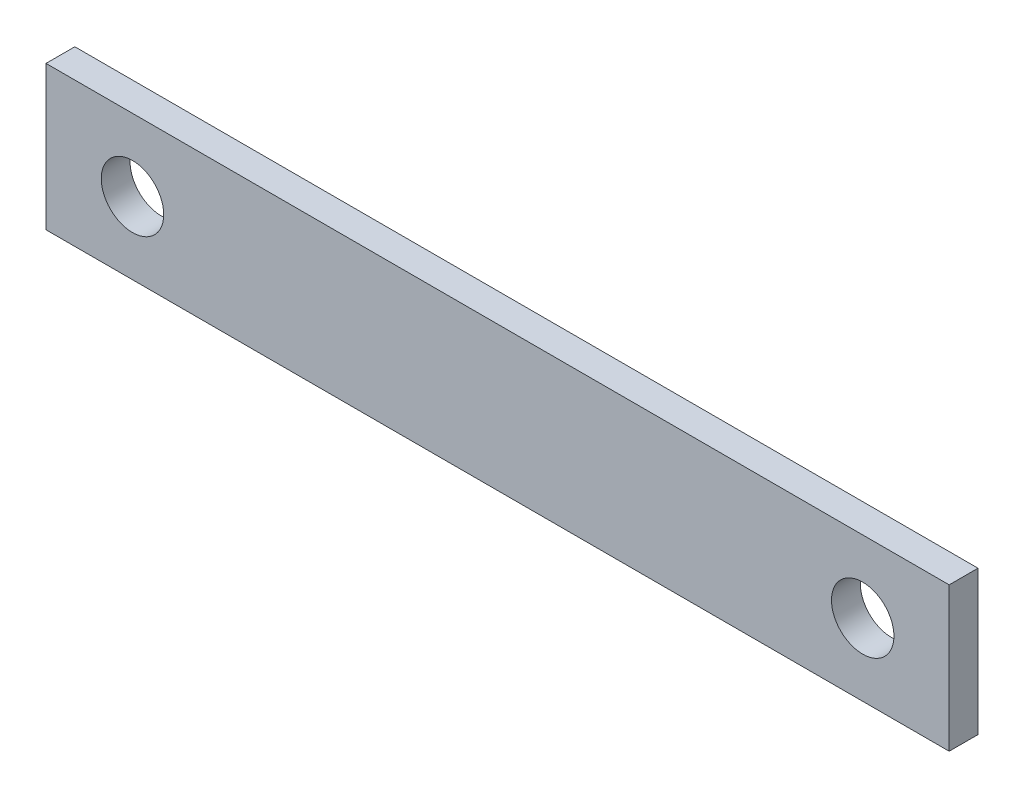
ISO-10303-21;
HEADER;
FILE_DESCRIPTION(('STEP AP214'),'2;1');
FILE_NAME('part.step','',(''),(''),'','','');
FILE_SCHEMA(('AUTOMOTIVE_DESIGN { 1 0 10303 214 1 1 1 1 }'));
ENDSEC;
DATA;
#1=APPLICATION_CONTEXT('core data for automotive mechanical design processes');
#2=APPLICATION_PROTOCOL_DEFINITION('international standard','automotive_design',2000,#1);
#3=PRODUCT_CONTEXT('',#1,'mechanical');
#4=PRODUCT('Part','Part','',(#3));
#5=PRODUCT_RELATED_PRODUCT_CATEGORY('part','',(#4));
#6=PRODUCT_DEFINITION_FORMATION('','',#4);
#7=PRODUCT_DEFINITION_CONTEXT('part definition',#1,'design');
#8=PRODUCT_DEFINITION('design','',#6,#7);
#9=PRODUCT_DEFINITION_SHAPE('','',#8);
#10=(LENGTH_UNIT() NAMED_UNIT(*) SI_UNIT(.MILLI.,.METRE.));
#11=(NAMED_UNIT(*) PLANE_ANGLE_UNIT() SI_UNIT($,.RADIAN.));
#12=(NAMED_UNIT(*) SI_UNIT($,.STERADIAN.) SOLID_ANGLE_UNIT());
#13=UNCERTAINTY_MEASURE_WITH_UNIT(LENGTH_MEASURE(1.E-05),#10,'distance_accuracy_value','');
#14=(GEOMETRIC_REPRESENTATION_CONTEXT(3) GLOBAL_UNCERTAINTY_ASSIGNED_CONTEXT((#13)) GLOBAL_UNIT_ASSIGNED_CONTEXT((#10,
#11,#12)) REPRESENTATION_CONTEXT('',''));
#15=CARTESIAN_POINT('',(0.,0.,0.));
#16=DIRECTION('',(0.,0.,1.));
#17=DIRECTION('',(1.,0.,0.));
#18=AXIS2_PLACEMENT_3D('',#15,#16,#17);
#19=CARTESIAN_POINT('',(-47.,7.49999999999999,3.));
#20=DIRECTION('',(1.,0.,0.));
#21=DIRECTION('',(0.,0.,-1.));
#22=AXIS2_PLACEMENT_3D('',#19,#20,#21);
#23=PLANE('',#22);
#24=DIRECTION('',(0.,-1.,0.));
#25=VECTOR('',#24,1.);
#26=CARTESIAN_POINT('',(-47.,7.49999999999999,0.));
#27=LINE('',#26,#25);
#28=CARTESIAN_POINT('',(-47.,7.49999999999999,0.));
#29=VERTEX_POINT('',#28);
#30=CARTESIAN_POINT('',(-47.,-7.50000000000001,0.));
#31=VERTEX_POINT('',#30);
#32=EDGE_CURVE('E96',#29,#31,#27,.T.);
#33=ORIENTED_EDGE('',*,*,#32,.T.);
#34=DIRECTION('',(0.,0.,-1.));
#35=VECTOR('',#34,1.);
#36=CARTESIAN_POINT('',(-47.,-7.50000000000001,3.));
#37=LINE('',#36,#35);
#38=CARTESIAN_POINT('',(-47.,-7.50000000000001,3.));
#39=VERTEX_POINT('',#38);
#40=EDGE_CURVE('E11',#39,#31,#37,.T.);
#41=ORIENTED_EDGE('',*,*,#40,.F.);
#42=DIRECTION('',(0.,-1.,0.));
#43=VECTOR('',#42,1.);
#44=CARTESIAN_POINT('',(-47.,7.49999999999999,3.));
#45=LINE('',#44,#43);
#46=CARTESIAN_POINT('',(-47.,7.49999999999999,3.));
#47=VERTEX_POINT('',#46);
#48=EDGE_CURVE('E84',#47,#39,#45,.T.);
#49=ORIENTED_EDGE('',*,*,#48,.F.);
#50=DIRECTION('',(0.,0.,-1.));
#51=VECTOR('',#50,1.);
#52=CARTESIAN_POINT('',(-47.,7.49999999999999,3.));
#53=LINE('',#52,#51);
#54=EDGE_CURVE('E92',#47,#29,#53,.T.);
#55=ORIENTED_EDGE('',*,*,#54,.T.);
#56=EDGE_LOOP('',(#33,#41,#49,#55));
#57=FACE_BOUND('',#56,.T.);
#58=ADVANCED_FACE('F33',(#57),#23,.F.);
#59=CARTESIAN_POINT('',(47.,-7.5,3.));
#60=DIRECTION('',(0.,1.,0.));
#61=DIRECTION('',(-1.,0.,0.));
#62=AXIS2_PLACEMENT_3D('',#59,#60,#61);
#63=PLANE('',#62);
#64=DIRECTION('',(1.,0.,0.));
#65=VECTOR('',#64,1.);
#66=CARTESIAN_POINT('',(47.,-7.5,0.));
#67=LINE('',#66,#65);
#68=CARTESIAN_POINT('',(47.,-7.5,0.));
#69=VERTEX_POINT('',#68);
#70=EDGE_CURVE('E88',#31,#69,#67,.T.);
#71=ORIENTED_EDGE('',*,*,#70,.T.);
#72=DIRECTION('',(0.,0.,-1.));
#73=VECTOR('',#72,1.);
#74=CARTESIAN_POINT('',(47.,-7.5,3.));
#75=LINE('',#74,#73);
#76=CARTESIAN_POINT('',(47.,-7.5,3.));
#77=VERTEX_POINT('',#76);
#78=EDGE_CURVE('E41',#77,#69,#75,.T.);
#79=ORIENTED_EDGE('',*,*,#78,.F.);
#80=DIRECTION('',(1.,0.,0.));
#81=VECTOR('',#80,1.);
#82=CARTESIAN_POINT('',(47.,-7.5,3.));
#83=LINE('',#82,#81);
#84=EDGE_CURVE('E79',#39,#77,#83,.T.);
#85=ORIENTED_EDGE('',*,*,#84,.F.);
#86=ORIENTED_EDGE('',*,*,#40,.T.);
#87=EDGE_LOOP('',(#71,#79,#85,#86));
#88=FACE_BOUND('',#87,.T.);
#89=ADVANCED_FACE('F87',(#88),#63,.F.);
#90=CARTESIAN_POINT('',(47.,7.50000000000001,3.));
#91=DIRECTION('',(-1.,0.,0.));
#92=DIRECTION('',(0.,0.,1.));
#93=AXIS2_PLACEMENT_3D('',#90,#91,#92);
#94=PLANE('',#93);
#95=DIRECTION('',(0.,1.,0.));
#96=VECTOR('',#95,1.);
#97=CARTESIAN_POINT('',(47.,7.50000000000001,0.));
#98=LINE('',#97,#96);
#99=CARTESIAN_POINT('',(47.,7.50000000000001,0.));
#100=VERTEX_POINT('',#99);
#101=EDGE_CURVE('E66',#69,#100,#98,.T.);
#102=ORIENTED_EDGE('',*,*,#101,.T.);
#103=DIRECTION('',(0.,0.,-1.));
#104=VECTOR('',#103,1.);
#105=CARTESIAN_POINT('',(47.,7.50000000000001,3.));
#106=LINE('',#105,#104);
#107=CARTESIAN_POINT('',(47.,7.50000000000001,3.));
#108=VERTEX_POINT('',#107);
#109=EDGE_CURVE('E89',#108,#100,#106,.T.);
#110=ORIENTED_EDGE('',*,*,#109,.F.);
#111=DIRECTION('',(0.,1.,0.));
#112=VECTOR('',#111,1.);
#113=CARTESIAN_POINT('',(47.,7.50000000000001,3.));
#114=LINE('',#113,#112);
#115=EDGE_CURVE('E82',#77,#108,#114,.T.);
#116=ORIENTED_EDGE('',*,*,#115,.F.);
#117=ORIENTED_EDGE('',*,*,#78,.T.);
#118=EDGE_LOOP('',(#102,#110,#116,#117));
#119=FACE_BOUND('',#118,.T.);
#120=ADVANCED_FACE('F90',(#119),#94,.F.);
#121=CARTESIAN_POINT('',(47.,7.50000000000001,3.));
#122=DIRECTION('',(0.,-1.,0.));
#123=DIRECTION('',(1.,0.,0.));
#124=AXIS2_PLACEMENT_3D('',#121,#122,#123);
#125=PLANE('',#124);
#126=DIRECTION('',(-1.,0.,0.));
#127=VECTOR('',#126,1.);
#128=CARTESIAN_POINT('',(47.,7.50000000000001,0.));
#129=LINE('',#128,#127);
#130=EDGE_CURVE('E72',#100,#29,#129,.T.);
#131=ORIENTED_EDGE('',*,*,#130,.T.);
#132=ORIENTED_EDGE('',*,*,#54,.F.);
#133=DIRECTION('',(-1.,0.,0.));
#134=VECTOR('',#133,1.);
#135=CARTESIAN_POINT('',(47.,7.50000000000001,3.));
#136=LINE('',#135,#134);
#137=EDGE_CURVE('E49',#108,#47,#136,.T.);
#138=ORIENTED_EDGE('',*,*,#137,.F.);
#139=ORIENTED_EDGE('',*,*,#109,.T.);
#140=EDGE_LOOP('',(#131,#132,#138,#139));
#141=FACE_BOUND('',#140,.T.);
#142=ADVANCED_FACE('F104',(#141),#125,.F.);
#143=CARTESIAN_POINT('',(0.,0.,3.));
#144=DIRECTION('',(0.,0.,-1.));
#145=DIRECTION('',(-1.,0.,0.));
#146=AXIS2_PLACEMENT_3D('',#143,#144,#145);
#147=PLANE('',#146);
#148=CARTESIAN_POINT('',(38.,0.,3.));
#149=DIRECTION('',(0.,0.,1.));
#150=DIRECTION('',(1.,0.,0.));
#151=AXIS2_PLACEMENT_3D('',#148,#149,#150);
#152=CIRCLE('',#151,3.25);
#153=CARTESIAN_POINT('',(41.25,0.,3.));
#154=VERTEX_POINT('',#153);
#155=EDGE_CURVE('E113',#154,#154,#152,.T.);
#156=ORIENTED_EDGE('',*,*,#155,.F.);
#157=EDGE_LOOP('',(#156));
#158=FACE_BOUND('',#157,.T.);
#159=CARTESIAN_POINT('',(-38.,0.,3.));
#160=DIRECTION('',(0.,0.,1.));
#161=DIRECTION('',(1.,0.,0.));
#162=AXIS2_PLACEMENT_3D('',#159,#160,#161);
#163=CIRCLE('',#162,3.25);
#164=CARTESIAN_POINT('',(-34.75,0.,3.));
#165=VERTEX_POINT('',#164);
#166=EDGE_CURVE('E99',#165,#165,#163,.T.);
#167=ORIENTED_EDGE('',*,*,#166,.F.);
#168=EDGE_LOOP('',(#167));
#169=FACE_BOUND('',#168,.T.);
#170=ORIENTED_EDGE('',*,*,#48,.T.);
#171=ORIENTED_EDGE('',*,*,#84,.T.);
#172=ORIENTED_EDGE('',*,*,#115,.T.);
#173=ORIENTED_EDGE('',*,*,#137,.T.);
#174=EDGE_LOOP('',(#170,#171,#172,#173));
#175=FACE_BOUND('',#174,.T.);
#176=ADVANCED_FACE('F80',(#158,#169,#175),#147,.F.);
#177=CARTESIAN_POINT('',(0.,0.,0.));
#178=DIRECTION('',(0.,0.,-1.));
#179=DIRECTION('',(-1.,0.,0.));
#180=AXIS2_PLACEMENT_3D('',#177,#178,#179);
#181=PLANE('',#180);
#182=CARTESIAN_POINT('',(38.,0.,0.));
#183=DIRECTION('',(0.,0.,-1.));
#184=DIRECTION('',(-1.,0.,0.));
#185=AXIS2_PLACEMENT_3D('',#182,#183,#184);
#186=CIRCLE('',#185,3.25);
#187=CARTESIAN_POINT('',(41.25,0.,0.));
#188=VERTEX_POINT('',#187);
#189=EDGE_CURVE('E116',#188,#188,#186,.F.);
#190=ORIENTED_EDGE('',*,*,#189,.T.);
#191=EDGE_LOOP('',(#190));
#192=FACE_BOUND('',#191,.T.);
#193=CARTESIAN_POINT('',(-38.,0.,0.));
#194=DIRECTION('',(0.,0.,-1.));
#195=DIRECTION('',(-1.,0.,0.));
#196=AXIS2_PLACEMENT_3D('',#193,#194,#195);
#197=CIRCLE('',#196,3.25);
#198=CARTESIAN_POINT('',(-34.75,0.,0.));
#199=VERTEX_POINT('',#198);
#200=EDGE_CURVE('E110',#199,#199,#197,.F.);
#201=ORIENTED_EDGE('',*,*,#200,.T.);
#202=EDGE_LOOP('',(#201));
#203=FACE_BOUND('',#202,.T.);
#204=ORIENTED_EDGE('',*,*,#32,.F.);
#205=ORIENTED_EDGE('',*,*,#130,.F.);
#206=ORIENTED_EDGE('',*,*,#101,.F.);
#207=ORIENTED_EDGE('',*,*,#70,.F.);
#208=EDGE_LOOP('',(#204,#205,#206,#207));
#209=FACE_BOUND('',#208,.T.);
#210=ADVANCED_FACE('F107',(#192,#203,#209),#181,.T.);
#211=CARTESIAN_POINT('',(-38.,0.,-0.00100000000000013));
#212=DIRECTION('',(0.,0.,1.));
#213=DIRECTION('',(1.,0.,0.));
#214=AXIS2_PLACEMENT_3D('',#211,#212,#213);
#215=CYLINDRICAL_SURFACE('',#214,3.25);
#216=CARTESIAN_POINT('',(-34.75,0.,0.));
#217=CARTESIAN_POINT('',(-34.75,0.,0.03125));
#218=CARTESIAN_POINT('',(-34.75,0.,0.0625));
#219=CARTESIAN_POINT('',(-34.75,0.,0.125));
#220=CARTESIAN_POINT('',(-34.75,0.,0.15625));
#221=CARTESIAN_POINT('',(-34.75,0.,0.21875));
#222=CARTESIAN_POINT('',(-34.75,0.,0.25));
#223=CARTESIAN_POINT('',(-34.75,0.,0.3125));
#224=CARTESIAN_POINT('',(-34.75,0.,0.34375));
#225=CARTESIAN_POINT('',(-34.75,0.,0.40625));
#226=CARTESIAN_POINT('',(-34.75,0.,0.4375));
#227=CARTESIAN_POINT('',(-34.75,0.,0.5));
#228=CARTESIAN_POINT('',(-34.75,0.,0.53125));
#229=CARTESIAN_POINT('',(-34.75,0.,0.59375));
#230=CARTESIAN_POINT('',(-34.75,0.,0.625));
#231=CARTESIAN_POINT('',(-34.75,0.,0.6875));
#232=CARTESIAN_POINT('',(-34.75,0.,0.71875));
#233=CARTESIAN_POINT('',(-34.75,0.,0.78125));
#234=CARTESIAN_POINT('',(-34.75,0.,0.8125));
#235=CARTESIAN_POINT('',(-34.75,0.,0.875));
#236=CARTESIAN_POINT('',(-34.75,0.,0.90625));
#237=CARTESIAN_POINT('',(-34.75,0.,0.96875));
#238=CARTESIAN_POINT('',(-34.75,0.,1.));
#239=CARTESIAN_POINT('',(-34.75,0.,1.0625));
#240=CARTESIAN_POINT('',(-34.75,0.,1.09375));
#241=CARTESIAN_POINT('',(-34.75,0.,1.15625));
#242=CARTESIAN_POINT('',(-34.75,0.,1.1875));
#243=CARTESIAN_POINT('',(-34.75,0.,1.25));
#244=CARTESIAN_POINT('',(-34.75,0.,1.28125));
#245=CARTESIAN_POINT('',(-34.75,0.,1.34375));
#246=CARTESIAN_POINT('',(-34.75,0.,1.375));
#247=CARTESIAN_POINT('',(-34.75,0.,1.4375));
#248=CARTESIAN_POINT('',(-34.75,0.,1.46875));
#249=CARTESIAN_POINT('',(-34.75,0.,1.53125));
#250=CARTESIAN_POINT('',(-34.75,0.,1.5625));
#251=CARTESIAN_POINT('',(-34.75,0.,1.625));
#252=CARTESIAN_POINT('',(-34.75,0.,1.65625));
#253=CARTESIAN_POINT('',(-34.75,0.,1.71875));
#254=CARTESIAN_POINT('',(-34.75,0.,1.75));
#255=CARTESIAN_POINT('',(-34.75,0.,1.8125));
#256=CARTESIAN_POINT('',(-34.75,0.,1.84375));
#257=CARTESIAN_POINT('',(-34.75,0.,1.90625));
#258=CARTESIAN_POINT('',(-34.75,0.,1.9375));
#259=CARTESIAN_POINT('',(-34.75,0.,2.));
#260=CARTESIAN_POINT('',(-34.75,0.,2.03125));
#261=CARTESIAN_POINT('',(-34.75,0.,2.09375));
#262=CARTESIAN_POINT('',(-34.75,0.,2.125));
#263=CARTESIAN_POINT('',(-34.75,0.,2.1875));
#264=CARTESIAN_POINT('',(-34.75,0.,2.21875));
#265=CARTESIAN_POINT('',(-34.75,0.,2.28125));
#266=CARTESIAN_POINT('',(-34.75,0.,2.3125));
#267=CARTESIAN_POINT('',(-34.75,0.,2.375));
#268=CARTESIAN_POINT('',(-34.75,0.,2.40625));
#269=CARTESIAN_POINT('',(-34.75,0.,2.46875));
#270=CARTESIAN_POINT('',(-34.75,0.,2.5));
#271=CARTESIAN_POINT('',(-34.75,0.,2.5625));
#272=CARTESIAN_POINT('',(-34.75,0.,2.59375));
#273=CARTESIAN_POINT('',(-34.75,0.,2.65625));
#274=CARTESIAN_POINT('',(-34.75,0.,2.6875));
#275=CARTESIAN_POINT('',(-34.75,0.,2.75));
#276=CARTESIAN_POINT('',(-34.75,0.,2.78125));
#277=CARTESIAN_POINT('',(-34.75,0.,2.84375));
#278=CARTESIAN_POINT('',(-34.75,0.,2.875));
#279=CARTESIAN_POINT('',(-34.75,0.,2.9375));
#280=CARTESIAN_POINT('',(-34.75,0.,2.96875));
#281=CARTESIAN_POINT('',(-34.75,0.,3.));
#282=B_SPLINE_CURVE_WITH_KNOTS('',3,(#216,#217,#218,#219,#220,#221,#222,#223,#224,#225,#226,
#227,#228,#229,#230,#231,#232,#233,#234,#235,#236,#237,#238,#239,#240,#241,#242,#243,#244,#245,
#246,#247,#248,#249,#250,#251,#252,#253,#254,#255,#256,#257,#258,#259,#260,#261,#262,#263,#264,
#265,#266,#267,#268,#269,#270,#271,#272,#273,#274,#275,#276,#277,#278,#279,#280,#281),
.UNSPECIFIED.,.F.,.F.,(4,2,2,2,2,2,2,2,2,2,2,2,2,2,2,2,2,2,2,2,2,2,2,2,2,2,2,2,2,2,2,2,4),(0.,
0.09375,0.1875,0.28125,0.375,0.46875,0.5625,0.65625,0.75,0.84375,0.9375,1.03125,1.125,1.21875,
1.3125,1.40625,1.5,1.59375,1.6875,1.78125,1.875,1.96875,2.0625,2.15625,2.25,2.34375,2.4375,
2.53125,2.625,2.71875,2.8125,2.90625,3.),.UNSPECIFIED.);
#283=EDGE_CURVE('BSEAM129',#199,#165,#282,.T.);
#284=ORIENTED_EDGE('',*,*,#200,.F.);
#285=ORIENTED_EDGE('',*,*,#166,.T.);
#286=ORIENTED_EDGE('',*,*,#283,.T.);
#287=ORIENTED_EDGE('',*,*,#283,.F.);
#288=EDGE_LOOP('',(#284,#286,#285,#287));
#289=FACE_BOUND('',#288,.T.);
#290=ADVANCED_FACE('F129',(#289),#215,.F.);
#291=CARTESIAN_POINT('',(38.,0.,-0.00100000000000013));
#292=DIRECTION('',(0.,0.,1.));
#293=DIRECTION('',(1.,0.,0.));
#294=AXIS2_PLACEMENT_3D('',#291,#292,#293);
#295=CYLINDRICAL_SURFACE('',#294,3.25);
#296=CARTESIAN_POINT('',(41.25,0.,0.));
#297=CARTESIAN_POINT('',(41.25,0.,0.03125));
#298=CARTESIAN_POINT('',(41.25,0.,0.0625));
#299=CARTESIAN_POINT('',(41.25,0.,0.125));
#300=CARTESIAN_POINT('',(41.25,0.,0.15625));
#301=CARTESIAN_POINT('',(41.25,0.,0.21875));
#302=CARTESIAN_POINT('',(41.25,0.,0.25));
#303=CARTESIAN_POINT('',(41.25,0.,0.3125));
#304=CARTESIAN_POINT('',(41.25,0.,0.34375));
#305=CARTESIAN_POINT('',(41.25,0.,0.40625));
#306=CARTESIAN_POINT('',(41.25,0.,0.4375));
#307=CARTESIAN_POINT('',(41.25,0.,0.5));
#308=CARTESIAN_POINT('',(41.25,0.,0.53125));
#309=CARTESIAN_POINT('',(41.25,0.,0.59375));
#310=CARTESIAN_POINT('',(41.25,0.,0.625));
#311=CARTESIAN_POINT('',(41.25,0.,0.6875));
#312=CARTESIAN_POINT('',(41.25,0.,0.71875));
#313=CARTESIAN_POINT('',(41.25,0.,0.78125));
#314=CARTESIAN_POINT('',(41.25,0.,0.8125));
#315=CARTESIAN_POINT('',(41.25,0.,0.875));
#316=CARTESIAN_POINT('',(41.25,0.,0.90625));
#317=CARTESIAN_POINT('',(41.25,0.,0.96875));
#318=CARTESIAN_POINT('',(41.25,0.,1.));
#319=CARTESIAN_POINT('',(41.25,0.,1.0625));
#320=CARTESIAN_POINT('',(41.25,0.,1.09375));
#321=CARTESIAN_POINT('',(41.25,0.,1.15625));
#322=CARTESIAN_POINT('',(41.25,0.,1.1875));
#323=CARTESIAN_POINT('',(41.25,0.,1.25));
#324=CARTESIAN_POINT('',(41.25,0.,1.28125));
#325=CARTESIAN_POINT('',(41.25,0.,1.34375));
#326=CARTESIAN_POINT('',(41.25,0.,1.375));
#327=CARTESIAN_POINT('',(41.25,0.,1.4375));
#328=CARTESIAN_POINT('',(41.25,0.,1.46875));
#329=CARTESIAN_POINT('',(41.25,0.,1.53125));
#330=CARTESIAN_POINT('',(41.25,0.,1.5625));
#331=CARTESIAN_POINT('',(41.25,0.,1.625));
#332=CARTESIAN_POINT('',(41.25,0.,1.65625));
#333=CARTESIAN_POINT('',(41.25,0.,1.71875));
#334=CARTESIAN_POINT('',(41.25,0.,1.75));
#335=CARTESIAN_POINT('',(41.25,0.,1.8125));
#336=CARTESIAN_POINT('',(41.25,0.,1.84375));
#337=CARTESIAN_POINT('',(41.25,0.,1.90625));
#338=CARTESIAN_POINT('',(41.25,0.,1.9375));
#339=CARTESIAN_POINT('',(41.25,0.,2.));
#340=CARTESIAN_POINT('',(41.25,0.,2.03125));
#341=CARTESIAN_POINT('',(41.25,0.,2.09375));
#342=CARTESIAN_POINT('',(41.25,0.,2.125));
#343=CARTESIAN_POINT('',(41.25,0.,2.1875));
#344=CARTESIAN_POINT('',(41.25,0.,2.21875));
#345=CARTESIAN_POINT('',(41.25,0.,2.28125));
#346=CARTESIAN_POINT('',(41.25,0.,2.3125));
#347=CARTESIAN_POINT('',(41.25,0.,2.375));
#348=CARTESIAN_POINT('',(41.25,0.,2.40625));
#349=CARTESIAN_POINT('',(41.25,0.,2.46875));
#350=CARTESIAN_POINT('',(41.25,0.,2.5));
#351=CARTESIAN_POINT('',(41.25,0.,2.5625));
#352=CARTESIAN_POINT('',(41.25,0.,2.59375));
#353=CARTESIAN_POINT('',(41.25,0.,2.65625));
#354=CARTESIAN_POINT('',(41.25,0.,2.6875));
#355=CARTESIAN_POINT('',(41.25,0.,2.75));
#356=CARTESIAN_POINT('',(41.25,0.,2.78125));
#357=CARTESIAN_POINT('',(41.25,0.,2.84375));
#358=CARTESIAN_POINT('',(41.25,0.,2.875));
#359=CARTESIAN_POINT('',(41.25,0.,2.9375));
#360=CARTESIAN_POINT('',(41.25,0.,2.96875));
#361=CARTESIAN_POINT('',(41.25,0.,3.));
#362=B_SPLINE_CURVE_WITH_KNOTS('',3,(#296,#297,#298,#299,#300,#301,#302,#303,#304,#305,#306,
#307,#308,#309,#310,#311,#312,#313,#314,#315,#316,#317,#318,#319,#320,#321,#322,#323,#324,#325,
#326,#327,#328,#329,#330,#331,#332,#333,#334,#335,#336,#337,#338,#339,#340,#341,#342,#343,#344,
#345,#346,#347,#348,#349,#350,#351,#352,#353,#354,#355,#356,#357,#358,#359,#360,#361),
.UNSPECIFIED.,.F.,.F.,(4,2,2,2,2,2,2,2,2,2,2,2,2,2,2,2,2,2,2,2,2,2,2,2,2,2,2,2,2,2,2,2,4),(0.,
0.09375,0.1875,0.28125,0.375,0.46875,0.5625,0.65625,0.75,0.84375,0.9375,1.03125,1.125,1.21875,
1.3125,1.40625,1.5,1.59375,1.6875,1.78125,1.875,1.96875,2.0625,2.15625,2.25,2.34375,2.4375,
2.53125,2.625,2.71875,2.8125,2.90625,3.),.UNSPECIFIED.);
#363=EDGE_CURVE('BSEAM122',#188,#154,#362,.T.);
#364=ORIENTED_EDGE('',*,*,#189,.F.);
#365=ORIENTED_EDGE('',*,*,#155,.T.);
#366=ORIENTED_EDGE('',*,*,#363,.T.);
#367=ORIENTED_EDGE('',*,*,#363,.F.);
#368=EDGE_LOOP('',(#364,#366,#365,#367));
#369=FACE_BOUND('',#368,.T.);
#370=ADVANCED_FACE('F122',(#369),#295,.F.);
#371=CLOSED_SHELL('',(#58,#89,#120,#142,#176,#210,#290,#370));
#372=MANIFOLD_SOLID_BREP('B2',#371);
#373=ADVANCED_BREP_SHAPE_REPRESENTATION('',(#18,#372),#14);
#374=SHAPE_DEFINITION_REPRESENTATION(#9,#373);
ENDSEC;
END-ISO-10303-21;
